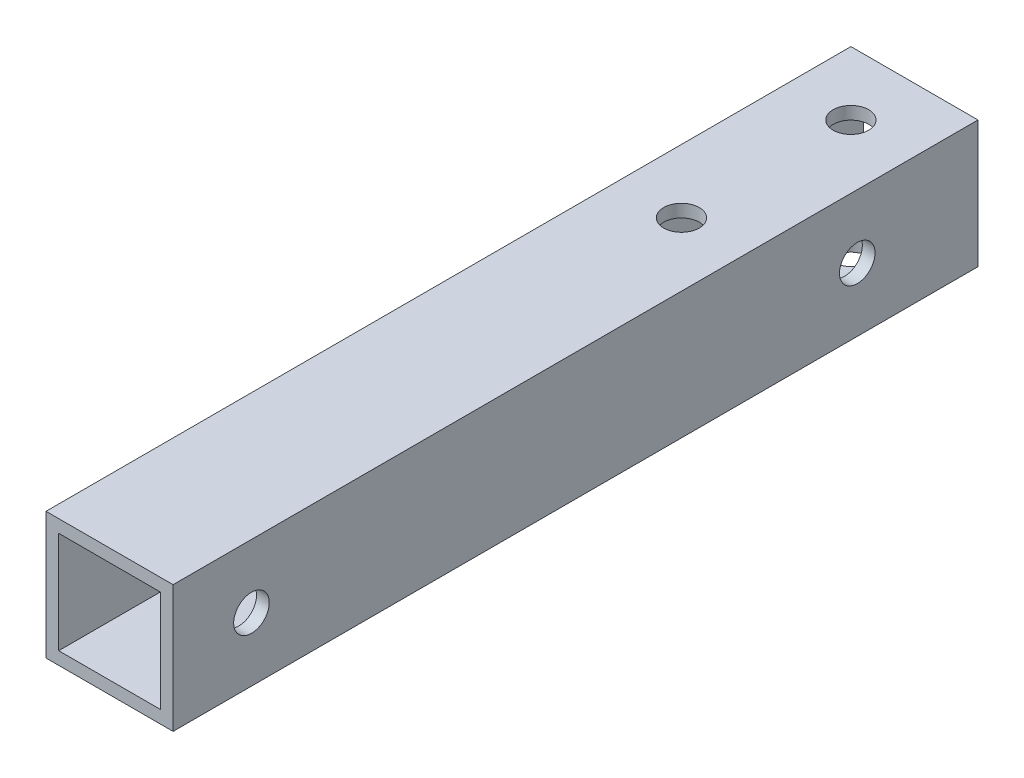
ISO-10303-21;
HEADER;
FILE_DESCRIPTION(('STEP AP214'),'2;1');
FILE_NAME('part.step','',(''),(''),'','','');
FILE_SCHEMA(('AUTOMOTIVE_DESIGN { 1 0 10303 214 1 1 1 1 }'));
ENDSEC;
DATA;
#1=APPLICATION_CONTEXT('core data for automotive mechanical design processes');
#2=APPLICATION_PROTOCOL_DEFINITION('international standard','automotive_design',2000,#1);
#3=PRODUCT_CONTEXT('',#1,'mechanical');
#4=PRODUCT('Part','Part','',(#3));
#5=PRODUCT_RELATED_PRODUCT_CATEGORY('part','',(#4));
#6=PRODUCT_DEFINITION_FORMATION('','',#4);
#7=PRODUCT_DEFINITION_CONTEXT('part definition',#1,'design');
#8=PRODUCT_DEFINITION('design','',#6,#7);
#9=PRODUCT_DEFINITION_SHAPE('','',#8);
#10=(LENGTH_UNIT() NAMED_UNIT(*) SI_UNIT(.MILLI.,.METRE.));
#11=(NAMED_UNIT(*) PLANE_ANGLE_UNIT() SI_UNIT($,.RADIAN.));
#12=(NAMED_UNIT(*) SI_UNIT($,.STERADIAN.) SOLID_ANGLE_UNIT());
#13=UNCERTAINTY_MEASURE_WITH_UNIT(LENGTH_MEASURE(1.E-05),#10,'distance_accuracy_value','');
#14=(GEOMETRIC_REPRESENTATION_CONTEXT(3) GLOBAL_UNCERTAINTY_ASSIGNED_CONTEXT((#13)) GLOBAL_UNIT_ASSIGNED_CONTEXT((#10,
#11,#12)) REPRESENTATION_CONTEXT('',''));
#15=CARTESIAN_POINT('',(0.,0.,0.));
#16=DIRECTION('',(0.,0.,1.));
#17=DIRECTION('',(1.,0.,0.));
#18=AXIS2_PLACEMENT_3D('',#15,#16,#17);
#19=CARTESIAN_POINT('',(0.,0.,95.));
#20=DIRECTION('',(0.,0.,1.));
#21=DIRECTION('',(1.,0.,0.));
#22=AXIS2_PLACEMENT_3D('',#19,#20,#21);
#23=PLANE('',#22);
#24=DIRECTION('',(0.,1.,0.));
#25=VECTOR('',#24,1.);
#26=CARTESIAN_POINT('',(7.5,7.5,95.));
#27=LINE('',#26,#25);
#28=CARTESIAN_POINT('',(7.5,-7.5,95.));
#29=VERTEX_POINT('',#28);
#30=CARTESIAN_POINT('',(7.5,7.5,95.));
#31=VERTEX_POINT('',#30);
#32=EDGE_CURVE('E164',#29,#31,#27,.T.);
#33=ORIENTED_EDGE('',*,*,#32,.T.);
#34=DIRECTION('',(-1.,0.,0.));
#35=VECTOR('',#34,1.);
#36=CARTESIAN_POINT('',(-7.5,7.5,95.));
#37=LINE('',#36,#35);
#38=CARTESIAN_POINT('',(-7.5,7.5,95.));
#39=VERTEX_POINT('',#38);
#40=EDGE_CURVE('E167',#31,#39,#37,.T.);
#41=ORIENTED_EDGE('',*,*,#40,.T.);
#42=DIRECTION('',(0.,-1.,0.));
#43=VECTOR('',#42,1.);
#44=CARTESIAN_POINT('',(-7.5,7.5,95.));
#45=LINE('',#44,#43);
#46=CARTESIAN_POINT('',(-7.5,-7.5,95.));
#47=VERTEX_POINT('',#46);
#48=EDGE_CURVE('E170',#39,#47,#45,.T.);
#49=ORIENTED_EDGE('',*,*,#48,.T.);
#50=DIRECTION('',(1.,0.,0.));
#51=VECTOR('',#50,1.);
#52=CARTESIAN_POINT('',(-7.5,-7.5,95.));
#53=LINE('',#52,#51);
#54=EDGE_CURVE('E172',#47,#29,#53,.T.);
#55=ORIENTED_EDGE('',*,*,#54,.T.);
#56=EDGE_LOOP('',(#33,#41,#49,#55));
#57=FACE_BOUND('',#56,.T.);
#58=DIRECTION('',(-1.,0.,0.));
#59=VECTOR('',#58,1.);
#60=CARTESIAN_POINT('',(-7.5,6.,95.));
#61=LINE('',#60,#59);
#62=CARTESIAN_POINT('',(6.,6.,95.));
#63=VERTEX_POINT('',#62);
#64=CARTESIAN_POINT('',(-6.,6.,95.));
#65=VERTEX_POINT('',#64);
#66=EDGE_CURVE('E134',#63,#65,#61,.T.);
#67=ORIENTED_EDGE('',*,*,#66,.F.);
#68=DIRECTION('',(0.,1.,0.));
#69=VECTOR('',#68,1.);
#70=CARTESIAN_POINT('',(6.,7.5,95.));
#71=LINE('',#70,#69);
#72=CARTESIAN_POINT('',(6.,-6.,95.));
#73=VERTEX_POINT('',#72);
#74=EDGE_CURVE('E126',#73,#63,#71,.T.);
#75=ORIENTED_EDGE('',*,*,#74,.F.);
#76=DIRECTION('',(1.,0.,0.));
#77=VECTOR('',#76,1.);
#78=CARTESIAN_POINT('',(-7.5,-6.,95.));
#79=LINE('',#78,#77);
#80=CARTESIAN_POINT('',(-6.,-6.,95.));
#81=VERTEX_POINT('',#80);
#82=EDGE_CURVE('E148',#81,#73,#79,.T.);
#83=ORIENTED_EDGE('',*,*,#82,.F.);
#84=DIRECTION('',(0.,-1.,0.));
#85=VECTOR('',#84,1.);
#86=CARTESIAN_POINT('',(-6.,7.5,95.));
#87=LINE('',#86,#85);
#88=EDGE_CURVE('E146',#65,#81,#87,.T.);
#89=ORIENTED_EDGE('',*,*,#88,.F.);
#90=EDGE_LOOP('',(#67,#75,#83,#89));
#91=FACE_BOUND('',#90,.T.);
#92=ADVANCED_FACE('F59',(#57,#91),#23,.T.);
#93=CARTESIAN_POINT('',(0.,0.,0.));
#94=DIRECTION('',(0.,0.,1.));
#95=DIRECTION('',(1.,0.,0.));
#96=AXIS2_PLACEMENT_3D('',#93,#94,#95);
#97=PLANE('',#96);
#98=DIRECTION('',(0.,1.,0.));
#99=VECTOR('',#98,1.);
#100=CARTESIAN_POINT('',(7.5,7.5,0.));
#101=LINE('',#100,#99);
#102=CARTESIAN_POINT('',(7.5,-7.5,0.));
#103=VERTEX_POINT('',#102);
#104=CARTESIAN_POINT('',(7.5,7.5,0.));
#105=VERTEX_POINT('',#104);
#106=EDGE_CURVE('E142',#103,#105,#101,.T.);
#107=ORIENTED_EDGE('',*,*,#106,.F.);
#108=DIRECTION('',(1.,0.,0.));
#109=VECTOR('',#108,1.);
#110=CARTESIAN_POINT('',(-7.5,-7.5,0.));
#111=LINE('',#110,#109);
#112=CARTESIAN_POINT('',(-7.5,-7.5,0.));
#113=VERTEX_POINT('',#112);
#114=EDGE_CURVE('E168',#113,#103,#111,.T.);
#115=ORIENTED_EDGE('',*,*,#114,.F.);
#116=DIRECTION('',(0.,-1.,0.));
#117=VECTOR('',#116,1.);
#118=CARTESIAN_POINT('',(-7.5,7.5,0.));
#119=LINE('',#118,#117);
#120=CARTESIAN_POINT('',(-7.5,7.5,0.));
#121=VERTEX_POINT('',#120);
#122=EDGE_CURVE('E179',#121,#113,#119,.T.);
#123=ORIENTED_EDGE('',*,*,#122,.F.);
#124=DIRECTION('',(-1.,0.,0.));
#125=VECTOR('',#124,1.);
#126=CARTESIAN_POINT('',(-7.5,7.5,0.));
#127=LINE('',#126,#125);
#128=EDGE_CURVE('E177',#105,#121,#127,.T.);
#129=ORIENTED_EDGE('',*,*,#128,.F.);
#130=EDGE_LOOP('',(#107,#115,#123,#129));
#131=FACE_BOUND('',#130,.T.);
#132=DIRECTION('',(0.,1.,0.));
#133=VECTOR('',#132,1.);
#134=CARTESIAN_POINT('',(6.,7.5,0.));
#135=LINE('',#134,#133);
#136=CARTESIAN_POINT('',(6.,-6.,0.));
#137=VERTEX_POINT('',#136);
#138=CARTESIAN_POINT('',(6.,6.,0.));
#139=VERTEX_POINT('',#138);
#140=EDGE_CURVE('E84',#137,#139,#135,.T.);
#141=ORIENTED_EDGE('',*,*,#140,.T.);
#142=DIRECTION('',(-1.,0.,0.));
#143=VECTOR('',#142,1.);
#144=CARTESIAN_POINT('',(-7.5,6.,0.));
#145=LINE('',#144,#143);
#146=CARTESIAN_POINT('',(-6.,6.,0.));
#147=VERTEX_POINT('',#146);
#148=EDGE_CURVE('E141',#139,#147,#145,.T.);
#149=ORIENTED_EDGE('',*,*,#148,.T.);
#150=DIRECTION('',(0.,-1.,0.));
#151=VECTOR('',#150,1.);
#152=CARTESIAN_POINT('',(-6.,7.5,0.));
#153=LINE('',#152,#151);
#154=CARTESIAN_POINT('',(-6.,-6.,0.));
#155=VERTEX_POINT('',#154);
#156=EDGE_CURVE('E156',#147,#155,#153,.T.);
#157=ORIENTED_EDGE('',*,*,#156,.T.);
#158=DIRECTION('',(1.,0.,0.));
#159=VECTOR('',#158,1.);
#160=CARTESIAN_POINT('',(-7.5,-6.,0.));
#161=LINE('',#160,#159);
#162=EDGE_CURVE('E135',#155,#137,#161,.T.);
#163=ORIENTED_EDGE('',*,*,#162,.T.);
#164=EDGE_LOOP('',(#141,#149,#157,#163));
#165=FACE_BOUND('',#164,.T.);
#166=ADVANCED_FACE('F256',(#131,#165),#97,.F.);
#167=CARTESIAN_POINT('',(7.5,7.5,95.));
#168=DIRECTION('',(-1.,0.,0.));
#169=DIRECTION('',(0.,-1.,0.));
#170=AXIS2_PLACEMENT_3D('',#167,#168,#169);
#171=PLANE('',#170);
#172=CARTESIAN_POINT('',(7.5,0.,14.25));
#173=DIRECTION('',(1.,0.,0.));
#174=DIRECTION('',(0.,1.,0.));
#175=AXIS2_PLACEMENT_3D('',#172,#173,#174);
#176=CIRCLE('',#175,2.1);
#177=CARTESIAN_POINT('',(7.5,2.10000000000001,14.25));
#178=VERTEX_POINT('',#177);
#179=EDGE_CURVE('E224',#178,#178,#176,.T.);
#180=ORIENTED_EDGE('',*,*,#179,.F.);
#181=EDGE_LOOP('',(#180));
#182=FACE_BOUND('',#181,.T.);
#183=CARTESIAN_POINT('',(7.5,0.,85.75));
#184=DIRECTION('',(1.,0.,0.));
#185=DIRECTION('',(0.,1.,0.));
#186=AXIS2_PLACEMENT_3D('',#183,#184,#185);
#187=CIRCLE('',#186,2.1);
#188=CARTESIAN_POINT('',(7.5,2.10000000000001,85.75));
#189=VERTEX_POINT('',#188);
#190=EDGE_CURVE('E221',#189,#189,#187,.T.);
#191=ORIENTED_EDGE('',*,*,#190,.F.);
#192=EDGE_LOOP('',(#191));
#193=FACE_BOUND('',#192,.T.);
#194=ORIENTED_EDGE('',*,*,#106,.T.);
#195=DIRECTION('',(0.,0.,-1.));
#196=VECTOR('',#195,1.);
#197=CARTESIAN_POINT('',(7.5,7.5,95.));
#198=LINE('',#197,#196);
#199=EDGE_CURVE('E12',#31,#105,#198,.T.);
#200=ORIENTED_EDGE('',*,*,#199,.F.);
#201=ORIENTED_EDGE('',*,*,#32,.F.);
#202=DIRECTION('',(0.,0.,-1.));
#203=VECTOR('',#202,1.);
#204=CARTESIAN_POINT('',(7.5,-7.5,95.));
#205=LINE('',#204,#203);
#206=EDGE_CURVE('E174',#29,#103,#205,.T.);
#207=ORIENTED_EDGE('',*,*,#206,.T.);
#208=EDGE_LOOP('',(#194,#200,#201,#207));
#209=FACE_BOUND('',#208,.T.);
#210=ADVANCED_FACE('F61',(#182,#193,#209),#171,.F.);
#211=CARTESIAN_POINT('',(-7.5,7.5,95.));
#212=DIRECTION('',(0.,-1.,0.));
#213=DIRECTION('',(0.,0.,-1.));
#214=AXIS2_PLACEMENT_3D('',#211,#212,#213);
#215=PLANE('',#214);
#216=CARTESIAN_POINT('',(0.,7.5,27.5));
#217=DIRECTION('',(0.,1.,0.));
#218=DIRECTION('',(0.,0.,1.));
#219=AXIS2_PLACEMENT_3D('',#216,#217,#218);
#220=CIRCLE('',#219,2.1);
#221=CARTESIAN_POINT('',(0.,7.5,29.6));
#222=VERTEX_POINT('',#221);
#223=EDGE_CURVE('E205',#222,#222,#220,.T.);
#224=ORIENTED_EDGE('',*,*,#223,.F.);
#225=EDGE_LOOP('',(#224));
#226=FACE_BOUND('',#225,.T.);
#227=CARTESIAN_POINT('',(0.,7.5,7.5));
#228=DIRECTION('',(0.,1.,0.));
#229=DIRECTION('',(0.,0.,1.));
#230=AXIS2_PLACEMENT_3D('',#227,#228,#229);
#231=CIRCLE('',#230,2.1);
#232=CARTESIAN_POINT('',(0.,7.5,9.6));
#233=VERTEX_POINT('',#232);
#234=EDGE_CURVE('E215',#233,#233,#231,.T.);
#235=ORIENTED_EDGE('',*,*,#234,.F.);
#236=EDGE_LOOP('',(#235));
#237=FACE_BOUND('',#236,.T.);
#238=ORIENTED_EDGE('',*,*,#128,.T.);
#239=DIRECTION('',(0.,0.,-1.));
#240=VECTOR('',#239,1.);
#241=CARTESIAN_POINT('',(-7.5,7.5,95.));
#242=LINE('',#241,#240);
#243=EDGE_CURVE('E68',#39,#121,#242,.T.);
#244=ORIENTED_EDGE('',*,*,#243,.F.);
#245=ORIENTED_EDGE('',*,*,#40,.F.);
#246=ORIENTED_EDGE('',*,*,#199,.T.);
#247=EDGE_LOOP('',(#238,#244,#245,#246));
#248=FACE_BOUND('',#247,.T.);
#249=ADVANCED_FACE('F255',(#226,#237,#248),#215,.F.);
#250=CARTESIAN_POINT('',(-7.5,7.5,95.));
#251=DIRECTION('',(1.,0.,0.));
#252=DIRECTION('',(0.,1.,0.));
#253=AXIS2_PLACEMENT_3D('',#250,#251,#252);
#254=PLANE('',#253);
#255=CARTESIAN_POINT('',(-7.5,0.,14.25));
#256=DIRECTION('',(1.,0.,0.));
#257=DIRECTION('',(0.,1.,0.));
#258=AXIS2_PLACEMENT_3D('',#255,#256,#257);
#259=CIRCLE('',#258,2.1);
#260=CARTESIAN_POINT('',(-7.5,2.1,14.25));
#261=VERTEX_POINT('',#260);
#262=EDGE_CURVE('E193',#261,#261,#259,.T.);
#263=ORIENTED_EDGE('',*,*,#262,.T.);
#264=EDGE_LOOP('',(#263));
#265=FACE_BOUND('',#264,.T.);
#266=CARTESIAN_POINT('',(-7.5,0.,85.75));
#267=DIRECTION('',(1.,0.,0.));
#268=DIRECTION('',(0.,1.,0.));
#269=AXIS2_PLACEMENT_3D('',#266,#267,#268);
#270=CIRCLE('',#269,2.1);
#271=CARTESIAN_POINT('',(-7.5,2.1,85.75));
#272=VERTEX_POINT('',#271);
#273=EDGE_CURVE('E227',#272,#272,#270,.T.);
#274=ORIENTED_EDGE('',*,*,#273,.T.);
#275=EDGE_LOOP('',(#274));
#276=FACE_BOUND('',#275,.T.);
#277=ORIENTED_EDGE('',*,*,#122,.T.);
#278=DIRECTION('',(0.,0.,-1.));
#279=VECTOR('',#278,1.);
#280=CARTESIAN_POINT('',(-7.5,-7.5,95.));
#281=LINE('',#280,#279);
#282=EDGE_CURVE('E184',#47,#113,#281,.T.);
#283=ORIENTED_EDGE('',*,*,#282,.F.);
#284=ORIENTED_EDGE('',*,*,#48,.F.);
#285=ORIENTED_EDGE('',*,*,#243,.T.);
#286=EDGE_LOOP('',(#277,#283,#284,#285));
#287=FACE_BOUND('',#286,.T.);
#288=ADVANCED_FACE('F274',(#265,#276,#287),#254,.F.);
#289=CARTESIAN_POINT('',(-7.5,-7.5,95.));
#290=DIRECTION('',(0.,1.,0.));
#291=DIRECTION('',(0.,0.,1.));
#292=AXIS2_PLACEMENT_3D('',#289,#290,#291);
#293=PLANE('',#292);
#294=CARTESIAN_POINT('',(0.,-7.5,27.5));
#295=DIRECTION('',(0.,1.,0.));
#296=DIRECTION('',(0.,0.,1.));
#297=AXIS2_PLACEMENT_3D('',#294,#295,#296);
#298=CIRCLE('',#297,2.1);
#299=CARTESIAN_POINT('',(0.,-7.5,29.6));
#300=VERTEX_POINT('',#299);
#301=EDGE_CURVE('E199',#300,#300,#298,.T.);
#302=ORIENTED_EDGE('',*,*,#301,.T.);
#303=EDGE_LOOP('',(#302));
#304=FACE_BOUND('',#303,.T.);
#305=CARTESIAN_POINT('',(0.,-7.5,7.5));
#306=DIRECTION('',(0.,1.,0.));
#307=DIRECTION('',(0.,0.,1.));
#308=AXIS2_PLACEMENT_3D('',#305,#306,#307);
#309=CIRCLE('',#308,2.1);
#310=CARTESIAN_POINT('',(0.,-7.5,9.6));
#311=VERTEX_POINT('',#310);
#312=EDGE_CURVE('E210',#311,#311,#309,.T.);
#313=ORIENTED_EDGE('',*,*,#312,.T.);
#314=EDGE_LOOP('',(#313));
#315=FACE_BOUND('',#314,.T.);
#316=ORIENTED_EDGE('',*,*,#114,.T.);
#317=ORIENTED_EDGE('',*,*,#206,.F.);
#318=ORIENTED_EDGE('',*,*,#54,.F.);
#319=ORIENTED_EDGE('',*,*,#282,.T.);
#320=EDGE_LOOP('',(#316,#317,#318,#319));
#321=FACE_BOUND('',#320,.T.);
#322=ADVANCED_FACE('F241',(#304,#315,#321),#293,.F.);
#323=CARTESIAN_POINT('',(6.,7.5,95.));
#324=DIRECTION('',(-1.,0.,0.));
#325=DIRECTION('',(0.,-1.,0.));
#326=AXIS2_PLACEMENT_3D('',#323,#324,#325);
#327=PLANE('',#326);
#328=CARTESIAN_POINT('',(6.,0.,14.25));
#329=DIRECTION('',(-1.,0.,0.));
#330=DIRECTION('',(0.,-1.,0.));
#331=AXIS2_PLACEMENT_3D('',#328,#329,#330);
#332=CIRCLE('',#331,2.1);
#333=CARTESIAN_POINT('',(6.,2.10000000000001,14.25));
#334=VERTEX_POINT('',#333);
#335=EDGE_CURVE('E154',#334,#334,#332,.T.);
#336=ORIENTED_EDGE('',*,*,#335,.F.);
#337=EDGE_LOOP('',(#336));
#338=FACE_BOUND('',#337,.T.);
#339=CARTESIAN_POINT('',(6.,0.,85.75));
#340=DIRECTION('',(-1.,0.,0.));
#341=DIRECTION('',(0.,-1.,0.));
#342=AXIS2_PLACEMENT_3D('',#339,#340,#341);
#343=CIRCLE('',#342,2.1);
#344=CARTESIAN_POINT('',(6.,2.10000000000001,85.75));
#345=VERTEX_POINT('',#344);
#346=EDGE_CURVE('E192',#345,#345,#343,.T.);
#347=ORIENTED_EDGE('',*,*,#346,.F.);
#348=EDGE_LOOP('',(#347));
#349=FACE_BOUND('',#348,.T.);
#350=ORIENTED_EDGE('',*,*,#140,.F.);
#351=DIRECTION('',(0.,0.,-1.));
#352=VECTOR('',#351,1.);
#353=CARTESIAN_POINT('',(6.,-6.,95.));
#354=LINE('',#353,#352);
#355=EDGE_CURVE('E130',#73,#137,#354,.T.);
#356=ORIENTED_EDGE('',*,*,#355,.F.);
#357=ORIENTED_EDGE('',*,*,#74,.T.);
#358=DIRECTION('',(0.,0.,-1.));
#359=VECTOR('',#358,1.);
#360=CARTESIAN_POINT('',(6.,6.,95.));
#361=LINE('',#360,#359);
#362=EDGE_CURVE('E129',#63,#139,#361,.T.);
#363=ORIENTED_EDGE('',*,*,#362,.T.);
#364=EDGE_LOOP('',(#350,#356,#357,#363));
#365=FACE_BOUND('',#364,.T.);
#366=ADVANCED_FACE('F128',(#338,#349,#365),#327,.T.);
#367=CARTESIAN_POINT('',(-7.5,6.,95.));
#368=DIRECTION('',(0.,-1.,0.));
#369=DIRECTION('',(0.,0.,-1.));
#370=AXIS2_PLACEMENT_3D('',#367,#368,#369);
#371=PLANE('',#370);
#372=CARTESIAN_POINT('',(0.,6.,27.5));
#373=DIRECTION('',(0.,-1.,0.));
#374=DIRECTION('',(0.,0.,-1.));
#375=AXIS2_PLACEMENT_3D('',#372,#373,#374);
#376=CIRCLE('',#375,2.1);
#377=CARTESIAN_POINT('',(0.,6.,25.4));
#378=VERTEX_POINT('',#377);
#379=EDGE_CURVE('E218',#378,#378,#376,.T.);
#380=ORIENTED_EDGE('',*,*,#379,.F.);
#381=EDGE_LOOP('',(#380));
#382=FACE_BOUND('',#381,.T.);
#383=CARTESIAN_POINT('',(0.,6.,7.5));
#384=DIRECTION('',(0.,-1.,0.));
#385=DIRECTION('',(0.,0.,-1.));
#386=AXIS2_PLACEMENT_3D('',#383,#384,#385);
#387=CIRCLE('',#386,2.1);
#388=CARTESIAN_POINT('',(0.,6.,5.4));
#389=VERTEX_POINT('',#388);
#390=EDGE_CURVE('E198',#389,#389,#387,.T.);
#391=ORIENTED_EDGE('',*,*,#390,.F.);
#392=EDGE_LOOP('',(#391));
#393=FACE_BOUND('',#392,.T.);
#394=ORIENTED_EDGE('',*,*,#148,.F.);
#395=ORIENTED_EDGE('',*,*,#362,.F.);
#396=ORIENTED_EDGE('',*,*,#66,.T.);
#397=DIRECTION('',(0.,0.,-1.));
#398=VECTOR('',#397,1.);
#399=CARTESIAN_POINT('',(-6.,6.,95.));
#400=LINE('',#399,#398);
#401=EDGE_CURVE('E143',#65,#147,#400,.T.);
#402=ORIENTED_EDGE('',*,*,#401,.T.);
#403=EDGE_LOOP('',(#394,#395,#396,#402));
#404=FACE_BOUND('',#403,.T.);
#405=ADVANCED_FACE('F138',(#382,#393,#404),#371,.T.);
#406=CARTESIAN_POINT('',(-6.,7.5,95.));
#407=DIRECTION('',(1.,0.,0.));
#408=DIRECTION('',(0.,1.,0.));
#409=AXIS2_PLACEMENT_3D('',#406,#407,#408);
#410=PLANE('',#409);
#411=CARTESIAN_POINT('',(-6.,0.,14.25));
#412=DIRECTION('',(1.,0.,0.));
#413=DIRECTION('',(0.,1.,0.));
#414=AXIS2_PLACEMENT_3D('',#411,#412,#413);
#415=CIRCLE('',#414,2.1);
#416=CARTESIAN_POINT('',(-6.,2.1,14.25));
#417=VERTEX_POINT('',#416);
#418=EDGE_CURVE('E194',#417,#417,#415,.T.);
#419=ORIENTED_EDGE('',*,*,#418,.F.);
#420=EDGE_LOOP('',(#419));
#421=FACE_BOUND('',#420,.T.);
#422=CARTESIAN_POINT('',(-6.,0.,85.75));
#423=DIRECTION('',(1.,0.,0.));
#424=DIRECTION('',(0.,1.,0.));
#425=AXIS2_PLACEMENT_3D('',#422,#423,#424);
#426=CIRCLE('',#425,2.1);
#427=CARTESIAN_POINT('',(-6.,2.1,85.75));
#428=VERTEX_POINT('',#427);
#429=EDGE_CURVE('E189',#428,#428,#426,.T.);
#430=ORIENTED_EDGE('',*,*,#429,.F.);
#431=EDGE_LOOP('',(#430));
#432=FACE_BOUND('',#431,.T.);
#433=ORIENTED_EDGE('',*,*,#156,.F.);
#434=ORIENTED_EDGE('',*,*,#401,.F.);
#435=ORIENTED_EDGE('',*,*,#88,.T.);
#436=DIRECTION('',(0.,0.,-1.));
#437=VECTOR('',#436,1.);
#438=CARTESIAN_POINT('',(-6.,-6.,95.));
#439=LINE('',#438,#437);
#440=EDGE_CURVE('E76',#81,#155,#439,.T.);
#441=ORIENTED_EDGE('',*,*,#440,.T.);
#442=EDGE_LOOP('',(#433,#434,#435,#441));
#443=FACE_BOUND('',#442,.T.);
#444=ADVANCED_FACE('F294',(#421,#432,#443),#410,.T.);
#445=CARTESIAN_POINT('',(-7.5,-6.,95.));
#446=DIRECTION('',(0.,1.,0.));
#447=DIRECTION('',(0.,0.,1.));
#448=AXIS2_PLACEMENT_3D('',#445,#446,#447);
#449=PLANE('',#448);
#450=CARTESIAN_POINT('',(0.,-6.,27.5));
#451=DIRECTION('',(0.,1.,0.));
#452=DIRECTION('',(0.,0.,1.));
#453=AXIS2_PLACEMENT_3D('',#450,#451,#452);
#454=CIRCLE('',#453,2.1);
#455=CARTESIAN_POINT('',(0.,-6.,29.6));
#456=VERTEX_POINT('',#455);
#457=EDGE_CURVE('E63',#456,#456,#454,.T.);
#458=ORIENTED_EDGE('',*,*,#457,.F.);
#459=EDGE_LOOP('',(#458));
#460=FACE_BOUND('',#459,.T.);
#461=CARTESIAN_POINT('',(0.,-6.,7.5));
#462=DIRECTION('',(0.,1.,0.));
#463=DIRECTION('',(0.,0.,1.));
#464=AXIS2_PLACEMENT_3D('',#461,#462,#463);
#465=CIRCLE('',#464,2.1);
#466=CARTESIAN_POINT('',(0.,-6.,9.6));
#467=VERTEX_POINT('',#466);
#468=EDGE_CURVE('E196',#467,#467,#465,.T.);
#469=ORIENTED_EDGE('',*,*,#468,.F.);
#470=EDGE_LOOP('',(#469));
#471=FACE_BOUND('',#470,.T.);
#472=ORIENTED_EDGE('',*,*,#162,.F.);
#473=ORIENTED_EDGE('',*,*,#440,.F.);
#474=ORIENTED_EDGE('',*,*,#82,.T.);
#475=ORIENTED_EDGE('',*,*,#355,.T.);
#476=EDGE_LOOP('',(#472,#473,#474,#475));
#477=FACE_BOUND('',#476,.T.);
#478=ADVANCED_FACE('F298',(#460,#471,#477),#449,.T.);
#479=CARTESIAN_POINT('',(-7.5,0.,85.75));
#480=DIRECTION('',(1.,0.,0.));
#481=DIRECTION('',(0.,1.,0.));
#482=AXIS2_PLACEMENT_3D('',#479,#480,#481);
#483=CYLINDRICAL_SURFACE('',#482,2.1);
#484=CARTESIAN_POINT('',(-6.,2.1,85.75));
#485=CARTESIAN_POINT('',(-6.015625,2.1,85.75));
#486=CARTESIAN_POINT('',(-6.03125,2.1,85.75));
#487=CARTESIAN_POINT('',(-6.0625,2.1,85.75));
#488=CARTESIAN_POINT('',(-6.078125,2.1,85.75));
#489=CARTESIAN_POINT('',(-6.109375,2.1,85.75));
#490=CARTESIAN_POINT('',(-6.125,2.1,85.75));
#491=CARTESIAN_POINT('',(-6.15625,2.1,85.75));
#492=CARTESIAN_POINT('',(-6.171875,2.1,85.75));
#493=CARTESIAN_POINT('',(-6.203125,2.1,85.75));
#494=CARTESIAN_POINT('',(-6.21875,2.1,85.75));
#495=CARTESIAN_POINT('',(-6.25,2.1,85.75));
#496=CARTESIAN_POINT('',(-6.265625,2.1,85.75));
#497=CARTESIAN_POINT('',(-6.296875,2.1,85.75));
#498=CARTESIAN_POINT('',(-6.3125,2.1,85.75));
#499=CARTESIAN_POINT('',(-6.34375,2.1,85.75));
#500=CARTESIAN_POINT('',(-6.359375,2.1,85.75));
#501=CARTESIAN_POINT('',(-6.390625,2.1,85.75));
#502=CARTESIAN_POINT('',(-6.40625,2.1,85.75));
#503=CARTESIAN_POINT('',(-6.4375,2.1,85.75));
#504=CARTESIAN_POINT('',(-6.453125,2.1,85.75));
#505=CARTESIAN_POINT('',(-6.484375,2.1,85.75));
#506=CARTESIAN_POINT('',(-6.5,2.1,85.75));
#507=CARTESIAN_POINT('',(-6.53125,2.1,85.75));
#508=CARTESIAN_POINT('',(-6.546875,2.1,85.75));
#509=CARTESIAN_POINT('',(-6.578125,2.1,85.75));
#510=CARTESIAN_POINT('',(-6.59375,2.1,85.75));
#511=CARTESIAN_POINT('',(-6.625,2.1,85.75));
#512=CARTESIAN_POINT('',(-6.640625,2.1,85.75));
#513=CARTESIAN_POINT('',(-6.671875,2.1,85.75));
#514=CARTESIAN_POINT('',(-6.6875,2.1,85.75));
#515=CARTESIAN_POINT('',(-6.71875,2.1,85.75));
#516=CARTESIAN_POINT('',(-6.734375,2.1,85.75));
#517=CARTESIAN_POINT('',(-6.765625,2.1,85.75));
#518=CARTESIAN_POINT('',(-6.78125,2.1,85.75));
#519=CARTESIAN_POINT('',(-6.8125,2.1,85.75));
#520=CARTESIAN_POINT('',(-6.828125,2.1,85.75));
#521=CARTESIAN_POINT('',(-6.859375,2.1,85.75));
#522=CARTESIAN_POINT('',(-6.875,2.1,85.75));
#523=CARTESIAN_POINT('',(-6.90625,2.1,85.75));
#524=CARTESIAN_POINT('',(-6.921875,2.1,85.75));
#525=CARTESIAN_POINT('',(-6.953125,2.1,85.75));
#526=CARTESIAN_POINT('',(-6.96875,2.1,85.75));
#527=CARTESIAN_POINT('',(-7.,2.1,85.75));
#528=CARTESIAN_POINT('',(-7.015625,2.1,85.75));
#529=CARTESIAN_POINT('',(-7.046875,2.1,85.75));
#530=CARTESIAN_POINT('',(-7.0625,2.1,85.75));
#531=CARTESIAN_POINT('',(-7.09375,2.1,85.75));
#532=CARTESIAN_POINT('',(-7.109375,2.1,85.75));
#533=CARTESIAN_POINT('',(-7.140625,2.1,85.75));
#534=CARTESIAN_POINT('',(-7.15625,2.1,85.75));
#535=CARTESIAN_POINT('',(-7.1875,2.1,85.75));
#536=CARTESIAN_POINT('',(-7.203125,2.1,85.75));
#537=CARTESIAN_POINT('',(-7.234375,2.1,85.75));
#538=CARTESIAN_POINT('',(-7.25,2.1,85.75));
#539=CARTESIAN_POINT('',(-7.28125,2.1,85.75));
#540=CARTESIAN_POINT('',(-7.296875,2.1,85.75));
#541=CARTESIAN_POINT('',(-7.328125,2.1,85.75));
#542=CARTESIAN_POINT('',(-7.34375,2.1,85.75));
#543=CARTESIAN_POINT('',(-7.375,2.1,85.75));
#544=CARTESIAN_POINT('',(-7.390625,2.1,85.75));
#545=CARTESIAN_POINT('',(-7.421875,2.1,85.75));
#546=CARTESIAN_POINT('',(-7.4375,2.1,85.75));
#547=CARTESIAN_POINT('',(-7.46875,2.1,85.75));
#548=CARTESIAN_POINT('',(-7.484375,2.1,85.75));
#549=CARTESIAN_POINT('',(-7.5,2.1,85.75));
#550=B_SPLINE_CURVE_WITH_KNOTS('',3,(#484,#485,#486,#487,#488,#489,#490,#491,#492,#493,#494,
#495,#496,#497,#498,#499,#500,#501,#502,#503,#504,#505,#506,#507,#508,#509,#510,#511,#512,#513,
#514,#515,#516,#517,#518,#519,#520,#521,#522,#523,#524,#525,#526,#527,#528,#529,#530,#531,#532,
#533,#534,#535,#536,#537,#538,#539,#540,#541,#542,#543,#544,#545,#546,#547,#548,#549),
.UNSPECIFIED.,.F.,.F.,(4,2,2,2,2,2,2,2,2,2,2,2,2,2,2,2,2,2,2,2,2,2,2,2,2,2,2,2,2,2,2,2,4),(0.,
0.046875,0.0937500000000001,0.140625,0.1875,0.234375,0.28125,0.328125,0.375,0.421875,0.46875,
0.515625000000001,0.5625,0.609375000000001,0.656250000000001,0.703125000000001,
0.750000000000002,0.796875000000002,0.843750000000002,0.890625000000002,0.937500000000002,
0.984375000000002,1.03125,1.078125,1.125,1.171875,1.21875,1.265625,1.3125,1.359375,1.40625,
1.453125,1.5),.UNSPECIFIED.);
#551=EDGE_CURVE('BSEAM250',#428,#272,#550,.T.);
#552=ORIENTED_EDGE('',*,*,#429,.T.);
#553=ORIENTED_EDGE('',*,*,#273,.F.);
#554=ORIENTED_EDGE('',*,*,#551,.T.);
#555=ORIENTED_EDGE('',*,*,#551,.F.);
#556=EDGE_LOOP('',(#552,#554,#553,#555));
#557=FACE_BOUND('',#556,.T.);
#558=ADVANCED_FACE('F250',(#557),#483,.F.);
#559=CARTESIAN_POINT('',(-7.5,0.,14.25));
#560=DIRECTION('',(1.,0.,0.));
#561=DIRECTION('',(0.,1.,0.));
#562=AXIS2_PLACEMENT_3D('',#559,#560,#561);
#563=CYLINDRICAL_SURFACE('',#562,2.1);
#564=CARTESIAN_POINT('',(-6.,2.1,14.25));
#565=CARTESIAN_POINT('',(-6.015625,2.1,14.25));
#566=CARTESIAN_POINT('',(-6.03125,2.1,14.25));
#567=CARTESIAN_POINT('',(-6.0625,2.1,14.25));
#568=CARTESIAN_POINT('',(-6.078125,2.1,14.25));
#569=CARTESIAN_POINT('',(-6.109375,2.1,14.25));
#570=CARTESIAN_POINT('',(-6.125,2.1,14.25));
#571=CARTESIAN_POINT('',(-6.15625,2.1,14.25));
#572=CARTESIAN_POINT('',(-6.171875,2.1,14.25));
#573=CARTESIAN_POINT('',(-6.203125,2.1,14.25));
#574=CARTESIAN_POINT('',(-6.21875,2.1,14.25));
#575=CARTESIAN_POINT('',(-6.25,2.1,14.25));
#576=CARTESIAN_POINT('',(-6.265625,2.1,14.25));
#577=CARTESIAN_POINT('',(-6.296875,2.1,14.25));
#578=CARTESIAN_POINT('',(-6.3125,2.1,14.25));
#579=CARTESIAN_POINT('',(-6.34375,2.1,14.25));
#580=CARTESIAN_POINT('',(-6.359375,2.1,14.25));
#581=CARTESIAN_POINT('',(-6.390625,2.1,14.25));
#582=CARTESIAN_POINT('',(-6.40625,2.1,14.25));
#583=CARTESIAN_POINT('',(-6.4375,2.1,14.25));
#584=CARTESIAN_POINT('',(-6.453125,2.1,14.25));
#585=CARTESIAN_POINT('',(-6.484375,2.1,14.25));
#586=CARTESIAN_POINT('',(-6.5,2.1,14.25));
#587=CARTESIAN_POINT('',(-6.53125,2.1,14.25));
#588=CARTESIAN_POINT('',(-6.546875,2.1,14.25));
#589=CARTESIAN_POINT('',(-6.578125,2.1,14.25));
#590=CARTESIAN_POINT('',(-6.59375,2.1,14.25));
#591=CARTESIAN_POINT('',(-6.625,2.1,14.25));
#592=CARTESIAN_POINT('',(-6.640625,2.1,14.25));
#593=CARTESIAN_POINT('',(-6.671875,2.1,14.25));
#594=CARTESIAN_POINT('',(-6.6875,2.1,14.25));
#595=CARTESIAN_POINT('',(-6.71875,2.1,14.25));
#596=CARTESIAN_POINT('',(-6.734375,2.1,14.25));
#597=CARTESIAN_POINT('',(-6.765625,2.1,14.25));
#598=CARTESIAN_POINT('',(-6.78125,2.1,14.25));
#599=CARTESIAN_POINT('',(-6.8125,2.1,14.25));
#600=CARTESIAN_POINT('',(-6.828125,2.1,14.25));
#601=CARTESIAN_POINT('',(-6.859375,2.1,14.25));
#602=CARTESIAN_POINT('',(-6.875,2.1,14.25));
#603=CARTESIAN_POINT('',(-6.90625,2.1,14.25));
#604=CARTESIAN_POINT('',(-6.921875,2.1,14.25));
#605=CARTESIAN_POINT('',(-6.953125,2.1,14.25));
#606=CARTESIAN_POINT('',(-6.96875,2.1,14.25));
#607=CARTESIAN_POINT('',(-7.,2.1,14.25));
#608=CARTESIAN_POINT('',(-7.015625,2.1,14.25));
#609=CARTESIAN_POINT('',(-7.046875,2.1,14.25));
#610=CARTESIAN_POINT('',(-7.0625,2.1,14.25));
#611=CARTESIAN_POINT('',(-7.09375,2.1,14.25));
#612=CARTESIAN_POINT('',(-7.109375,2.1,14.25));
#613=CARTESIAN_POINT('',(-7.140625,2.1,14.25));
#614=CARTESIAN_POINT('',(-7.15625,2.1,14.25));
#615=CARTESIAN_POINT('',(-7.1875,2.1,14.25));
#616=CARTESIAN_POINT('',(-7.203125,2.1,14.25));
#617=CARTESIAN_POINT('',(-7.234375,2.1,14.25));
#618=CARTESIAN_POINT('',(-7.25,2.1,14.25));
#619=CARTESIAN_POINT('',(-7.28125,2.1,14.25));
#620=CARTESIAN_POINT('',(-7.296875,2.1,14.25));
#621=CARTESIAN_POINT('',(-7.328125,2.1,14.25));
#622=CARTESIAN_POINT('',(-7.34375,2.1,14.25));
#623=CARTESIAN_POINT('',(-7.375,2.1,14.25));
#624=CARTESIAN_POINT('',(-7.390625,2.1,14.25));
#625=CARTESIAN_POINT('',(-7.421875,2.1,14.25));
#626=CARTESIAN_POINT('',(-7.4375,2.1,14.25));
#627=CARTESIAN_POINT('',(-7.46875,2.1,14.25));
#628=CARTESIAN_POINT('',(-7.484375,2.1,14.25));
#629=CARTESIAN_POINT('',(-7.5,2.1,14.25));
#630=B_SPLINE_CURVE_WITH_KNOTS('',3,(#564,#565,#566,#567,#568,#569,#570,#571,#572,#573,#574,
#575,#576,#577,#578,#579,#580,#581,#582,#583,#584,#585,#586,#587,#588,#589,#590,#591,#592,#593,
#594,#595,#596,#597,#598,#599,#600,#601,#602,#603,#604,#605,#606,#607,#608,#609,#610,#611,#612,
#613,#614,#615,#616,#617,#618,#619,#620,#621,#622,#623,#624,#625,#626,#627,#628,#629),
.UNSPECIFIED.,.F.,.F.,(4,2,2,2,2,2,2,2,2,2,2,2,2,2,2,2,2,2,2,2,2,2,2,2,2,2,2,2,2,2,2,2,4),(0.,
0.046875,0.0937500000000001,0.140625,0.1875,0.234375,0.28125,0.328125,0.375,0.421875,0.46875,
0.515625000000001,0.5625,0.609375000000001,0.656250000000001,0.703125000000001,
0.750000000000002,0.796875000000002,0.843750000000002,0.890625000000002,0.937500000000002,
0.984375000000002,1.03125,1.078125,1.125,1.171875,1.21875,1.265625,1.3125,1.359375,1.40625,
1.453125,1.5),.UNSPECIFIED.);
#631=EDGE_CURVE('BSEAM248',#417,#261,#630,.T.);
#632=ORIENTED_EDGE('',*,*,#418,.T.);
#633=ORIENTED_EDGE('',*,*,#262,.F.);
#634=ORIENTED_EDGE('',*,*,#631,.T.);
#635=ORIENTED_EDGE('',*,*,#631,.F.);
#636=EDGE_LOOP('',(#632,#634,#633,#635));
#637=FACE_BOUND('',#636,.T.);
#638=ADVANCED_FACE('F248',(#637),#563,.F.);
#639=CARTESIAN_POINT('',(6.,2.10000000000001,85.75));
#640=CARTESIAN_POINT('',(6.015625,2.10000000000001,85.75));
#641=CARTESIAN_POINT('',(6.03125,2.10000000000001,85.75));
#642=CARTESIAN_POINT('',(6.0625,2.10000000000001,85.75));
#643=CARTESIAN_POINT('',(6.078125,2.10000000000001,85.75));
#644=CARTESIAN_POINT('',(6.109375,2.10000000000001,85.75));
#645=CARTESIAN_POINT('',(6.125,2.10000000000001,85.75));
#646=CARTESIAN_POINT('',(6.15625,2.10000000000001,85.75));
#647=CARTESIAN_POINT('',(6.171875,2.10000000000001,85.75));
#648=CARTESIAN_POINT('',(6.203125,2.10000000000001,85.75));
#649=CARTESIAN_POINT('',(6.21875,2.10000000000001,85.75));
#650=CARTESIAN_POINT('',(6.25,2.10000000000001,85.75));
#651=CARTESIAN_POINT('',(6.265625,2.10000000000001,85.75));
#652=CARTESIAN_POINT('',(6.296875,2.10000000000001,85.75));
#653=CARTESIAN_POINT('',(6.3125,2.10000000000001,85.75));
#654=CARTESIAN_POINT('',(6.34375,2.10000000000001,85.75));
#655=CARTESIAN_POINT('',(6.359375,2.10000000000001,85.75));
#656=CARTESIAN_POINT('',(6.390625,2.10000000000001,85.75));
#657=CARTESIAN_POINT('',(6.40625,2.10000000000001,85.75));
#658=CARTESIAN_POINT('',(6.4375,2.10000000000001,85.75));
#659=CARTESIAN_POINT('',(6.453125,2.10000000000001,85.75));
#660=CARTESIAN_POINT('',(6.484375,2.10000000000001,85.75));
#661=CARTESIAN_POINT('',(6.5,2.10000000000001,85.75));
#662=CARTESIAN_POINT('',(6.53125,2.10000000000001,85.75));
#663=CARTESIAN_POINT('',(6.546875,2.10000000000001,85.75));
#664=CARTESIAN_POINT('',(6.578125,2.10000000000001,85.75));
#665=CARTESIAN_POINT('',(6.59375,2.10000000000001,85.75));
#666=CARTESIAN_POINT('',(6.625,2.10000000000001,85.75));
#667=CARTESIAN_POINT('',(6.640625,2.10000000000001,85.75));
#668=CARTESIAN_POINT('',(6.671875,2.10000000000001,85.75));
#669=CARTESIAN_POINT('',(6.6875,2.10000000000001,85.75));
#670=CARTESIAN_POINT('',(6.71875,2.10000000000001,85.75));
#671=CARTESIAN_POINT('',(6.734375,2.10000000000001,85.75));
#672=CARTESIAN_POINT('',(6.765625,2.10000000000001,85.75));
#673=CARTESIAN_POINT('',(6.78125,2.10000000000001,85.75));
#674=CARTESIAN_POINT('',(6.8125,2.10000000000001,85.75));
#675=CARTESIAN_POINT('',(6.828125,2.10000000000001,85.75));
#676=CARTESIAN_POINT('',(6.859375,2.10000000000001,85.75));
#677=CARTESIAN_POINT('',(6.875,2.10000000000001,85.75));
#678=CARTESIAN_POINT('',(6.90625,2.10000000000001,85.75));
#679=CARTESIAN_POINT('',(6.921875,2.10000000000001,85.75));
#680=CARTESIAN_POINT('',(6.953125,2.10000000000001,85.75));
#681=CARTESIAN_POINT('',(6.96875,2.10000000000001,85.75));
#682=CARTESIAN_POINT('',(7.,2.10000000000001,85.75));
#683=CARTESIAN_POINT('',(7.015625,2.10000000000001,85.75));
#684=CARTESIAN_POINT('',(7.046875,2.10000000000001,85.75));
#685=CARTESIAN_POINT('',(7.0625,2.10000000000001,85.75));
#686=CARTESIAN_POINT('',(7.09375,2.10000000000001,85.75));
#687=CARTESIAN_POINT('',(7.109375,2.10000000000001,85.75));
#688=CARTESIAN_POINT('',(7.140625,2.10000000000001,85.75));
#689=CARTESIAN_POINT('',(7.15625,2.10000000000001,85.75));
#690=CARTESIAN_POINT('',(7.1875,2.10000000000001,85.75));
#691=CARTESIAN_POINT('',(7.203125,2.10000000000001,85.75));
#692=CARTESIAN_POINT('',(7.234375,2.10000000000001,85.75));
#693=CARTESIAN_POINT('',(7.25,2.10000000000001,85.75));
#694=CARTESIAN_POINT('',(7.28125,2.10000000000001,85.75));
#695=CARTESIAN_POINT('',(7.296875,2.10000000000001,85.75));
#696=CARTESIAN_POINT('',(7.328125,2.10000000000001,85.75));
#697=CARTESIAN_POINT('',(7.34375,2.10000000000001,85.75));
#698=CARTESIAN_POINT('',(7.375,2.10000000000001,85.75));
#699=CARTESIAN_POINT('',(7.390625,2.10000000000001,85.75));
#700=CARTESIAN_POINT('',(7.421875,2.10000000000001,85.75));
#701=CARTESIAN_POINT('',(7.4375,2.10000000000001,85.75));
#702=CARTESIAN_POINT('',(7.46875,2.10000000000001,85.75));
#703=CARTESIAN_POINT('',(7.484375,2.10000000000001,85.75));
#704=CARTESIAN_POINT('',(7.5,2.10000000000001,85.75));
#705=B_SPLINE_CURVE_WITH_KNOTS('',3,(#639,#640,#641,#642,#643,#644,#645,#646,#647,#648,#649,
#650,#651,#652,#653,#654,#655,#656,#657,#658,#659,#660,#661,#662,#663,#664,#665,#666,#667,#668,
#669,#670,#671,#672,#673,#674,#675,#676,#677,#678,#679,#680,#681,#682,#683,#684,#685,#686,#687,
#688,#689,#690,#691,#692,#693,#694,#695,#696,#697,#698,#699,#700,#701,#702,#703,#704),
.UNSPECIFIED.,.F.,.F.,(4,2,2,2,2,2,2,2,2,2,2,2,2,2,2,2,2,2,2,2,2,2,2,2,2,2,2,2,2,2,2,2,4),(0.,
0.046875,0.0937500000000001,0.140625,0.1875,0.234375,0.28125,0.328125,0.375,0.421875,0.46875,
0.515625,0.5625,0.609375000000001,0.656250000000001,0.703125000000001,0.750000000000001,
0.796875000000001,0.843750000000001,0.890625000000001,0.937500000000001,0.984375000000001,
1.03125,1.078125,1.125,1.171875,1.21875,1.265625,1.3125,1.359375,1.40625,1.453125,1.5),.UNSPECIFIED.);
#706=EDGE_CURVE('BSEAM245',#345,#189,#705,.T.);
#707=ORIENTED_EDGE('',*,*,#346,.T.);
#708=ORIENTED_EDGE('',*,*,#190,.T.);
#709=ORIENTED_EDGE('',*,*,#706,.T.);
#710=ORIENTED_EDGE('',*,*,#706,.F.);
#711=EDGE_LOOP('',(#707,#709,#708,#710));
#712=FACE_BOUND('',#711,.T.);
#713=ADVANCED_FACE('F245',(#712),#483,.F.);
#714=CARTESIAN_POINT('',(6.,2.10000000000001,14.25));
#715=CARTESIAN_POINT('',(6.015625,2.10000000000001,14.25));
#716=CARTESIAN_POINT('',(6.03125,2.10000000000001,14.25));
#717=CARTESIAN_POINT('',(6.0625,2.10000000000001,14.25));
#718=CARTESIAN_POINT('',(6.078125,2.10000000000001,14.25));
#719=CARTESIAN_POINT('',(6.109375,2.10000000000001,14.25));
#720=CARTESIAN_POINT('',(6.125,2.10000000000001,14.25));
#721=CARTESIAN_POINT('',(6.15625,2.10000000000001,14.25));
#722=CARTESIAN_POINT('',(6.171875,2.10000000000001,14.25));
#723=CARTESIAN_POINT('',(6.203125,2.10000000000001,14.25));
#724=CARTESIAN_POINT('',(6.21875,2.10000000000001,14.25));
#725=CARTESIAN_POINT('',(6.25,2.10000000000001,14.25));
#726=CARTESIAN_POINT('',(6.265625,2.10000000000001,14.25));
#727=CARTESIAN_POINT('',(6.296875,2.10000000000001,14.25));
#728=CARTESIAN_POINT('',(6.3125,2.10000000000001,14.25));
#729=CARTESIAN_POINT('',(6.34375,2.10000000000001,14.25));
#730=CARTESIAN_POINT('',(6.359375,2.10000000000001,14.25));
#731=CARTESIAN_POINT('',(6.390625,2.10000000000001,14.25));
#732=CARTESIAN_POINT('',(6.40625,2.10000000000001,14.25));
#733=CARTESIAN_POINT('',(6.4375,2.10000000000001,14.25));
#734=CARTESIAN_POINT('',(6.453125,2.10000000000001,14.25));
#735=CARTESIAN_POINT('',(6.484375,2.10000000000001,14.25));
#736=CARTESIAN_POINT('',(6.5,2.10000000000001,14.25));
#737=CARTESIAN_POINT('',(6.53125,2.10000000000001,14.25));
#738=CARTESIAN_POINT('',(6.546875,2.10000000000001,14.25));
#739=CARTESIAN_POINT('',(6.578125,2.10000000000001,14.25));
#740=CARTESIAN_POINT('',(6.59375,2.10000000000001,14.25));
#741=CARTESIAN_POINT('',(6.625,2.10000000000001,14.25));
#742=CARTESIAN_POINT('',(6.640625,2.10000000000001,14.25));
#743=CARTESIAN_POINT('',(6.671875,2.10000000000001,14.25));
#744=CARTESIAN_POINT('',(6.6875,2.10000000000001,14.25));
#745=CARTESIAN_POINT('',(6.71875,2.10000000000001,14.25));
#746=CARTESIAN_POINT('',(6.734375,2.10000000000001,14.25));
#747=CARTESIAN_POINT('',(6.765625,2.10000000000001,14.25));
#748=CARTESIAN_POINT('',(6.78125,2.10000000000001,14.25));
#749=CARTESIAN_POINT('',(6.8125,2.10000000000001,14.25));
#750=CARTESIAN_POINT('',(6.828125,2.10000000000001,14.25));
#751=CARTESIAN_POINT('',(6.859375,2.10000000000001,14.25));
#752=CARTESIAN_POINT('',(6.875,2.10000000000001,14.25));
#753=CARTESIAN_POINT('',(6.90625,2.10000000000001,14.25));
#754=CARTESIAN_POINT('',(6.921875,2.10000000000001,14.25));
#755=CARTESIAN_POINT('',(6.953125,2.10000000000001,14.25));
#756=CARTESIAN_POINT('',(6.96875,2.10000000000001,14.25));
#757=CARTESIAN_POINT('',(7.,2.10000000000001,14.25));
#758=CARTESIAN_POINT('',(7.015625,2.10000000000001,14.25));
#759=CARTESIAN_POINT('',(7.046875,2.10000000000001,14.25));
#760=CARTESIAN_POINT('',(7.0625,2.10000000000001,14.25));
#761=CARTESIAN_POINT('',(7.09375,2.10000000000001,14.25));
#762=CARTESIAN_POINT('',(7.109375,2.10000000000001,14.25));
#763=CARTESIAN_POINT('',(7.140625,2.10000000000001,14.25));
#764=CARTESIAN_POINT('',(7.15625,2.10000000000001,14.25));
#765=CARTESIAN_POINT('',(7.1875,2.10000000000001,14.25));
#766=CARTESIAN_POINT('',(7.203125,2.10000000000001,14.25));
#767=CARTESIAN_POINT('',(7.234375,2.10000000000001,14.25));
#768=CARTESIAN_POINT('',(7.25,2.10000000000001,14.25));
#769=CARTESIAN_POINT('',(7.28125,2.10000000000001,14.25));
#770=CARTESIAN_POINT('',(7.296875,2.10000000000001,14.25));
#771=CARTESIAN_POINT('',(7.328125,2.10000000000001,14.25));
#772=CARTESIAN_POINT('',(7.34375,2.10000000000001,14.25));
#773=CARTESIAN_POINT('',(7.375,2.10000000000001,14.25));
#774=CARTESIAN_POINT('',(7.390625,2.10000000000001,14.25));
#775=CARTESIAN_POINT('',(7.421875,2.10000000000001,14.25));
#776=CARTESIAN_POINT('',(7.4375,2.10000000000001,14.25));
#777=CARTESIAN_POINT('',(7.46875,2.10000000000001,14.25));
#778=CARTESIAN_POINT('',(7.484375,2.10000000000001,14.25));
#779=CARTESIAN_POINT('',(7.5,2.10000000000001,14.25));
#780=B_SPLINE_CURVE_WITH_KNOTS('',3,(#714,#715,#716,#717,#718,#719,#720,#721,#722,#723,#724,
#725,#726,#727,#728,#729,#730,#731,#732,#733,#734,#735,#736,#737,#738,#739,#740,#741,#742,#743,
#744,#745,#746,#747,#748,#749,#750,#751,#752,#753,#754,#755,#756,#757,#758,#759,#760,#761,#762,
#763,#764,#765,#766,#767,#768,#769,#770,#771,#772,#773,#774,#775,#776,#777,#778,#779),
.UNSPECIFIED.,.F.,.F.,(4,2,2,2,2,2,2,2,2,2,2,2,2,2,2,2,2,2,2,2,2,2,2,2,2,2,2,2,2,2,2,2,4),(0.,
0.046875,0.0937500000000001,0.140625,0.1875,0.234375,0.28125,0.328125,0.375,0.421875,0.46875,
0.515625,0.5625,0.609375000000001,0.656250000000001,0.703125000000001,0.750000000000001,
0.796875000000001,0.843750000000001,0.890625000000001,0.937500000000001,0.984375000000001,
1.03125,1.078125,1.125,1.171875,1.21875,1.265625,1.3125,1.359375,1.40625,1.453125,1.5),.UNSPECIFIED.);
#781=EDGE_CURVE('BSEAM236',#334,#178,#780,.T.);
#782=ORIENTED_EDGE('',*,*,#335,.T.);
#783=ORIENTED_EDGE('',*,*,#179,.T.);
#784=ORIENTED_EDGE('',*,*,#781,.T.);
#785=ORIENTED_EDGE('',*,*,#781,.F.);
#786=EDGE_LOOP('',(#782,#784,#783,#785));
#787=FACE_BOUND('',#786,.T.);
#788=ADVANCED_FACE('F236',(#787),#563,.F.);
#789=CARTESIAN_POINT('',(0.,-7.5,7.5));
#790=DIRECTION('',(0.,1.,0.));
#791=DIRECTION('',(0.,0.,1.));
#792=AXIS2_PLACEMENT_3D('',#789,#790,#791);
#793=CYLINDRICAL_SURFACE('',#792,2.1);
#794=ORIENTED_EDGE('',*,*,#468,.T.);
#795=EDGE_LOOP('',(#794));
#796=FACE_BOUND('',#795,.T.);
#797=ORIENTED_EDGE('',*,*,#312,.F.);
#798=EDGE_LOOP('',(#797));
#799=FACE_BOUND('',#798,.T.);
#800=ADVANCED_FACE('F308',(#796,#799),#793,.F.);
#801=CARTESIAN_POINT('',(0.,-7.5,27.5));
#802=DIRECTION('',(0.,1.,0.));
#803=DIRECTION('',(0.,0.,1.));
#804=AXIS2_PLACEMENT_3D('',#801,#802,#803);
#805=CYLINDRICAL_SURFACE('',#804,2.1);
#806=ORIENTED_EDGE('',*,*,#457,.T.);
#807=EDGE_LOOP('',(#806));
#808=FACE_BOUND('',#807,.T.);
#809=ORIENTED_EDGE('',*,*,#301,.F.);
#810=EDGE_LOOP('',(#809));
#811=FACE_BOUND('',#810,.T.);
#812=ADVANCED_FACE('F311',(#808,#811),#805,.F.);
#813=ORIENTED_EDGE('',*,*,#390,.T.);
#814=EDGE_LOOP('',(#813));
#815=FACE_BOUND('',#814,.T.);
#816=ORIENTED_EDGE('',*,*,#234,.T.);
#817=EDGE_LOOP('',(#816));
#818=FACE_BOUND('',#817,.T.);
#819=ADVANCED_FACE('F312',(#815,#818),#793,.F.);
#820=ORIENTED_EDGE('',*,*,#379,.T.);
#821=EDGE_LOOP('',(#820));
#822=FACE_BOUND('',#821,.T.);
#823=ORIENTED_EDGE('',*,*,#223,.T.);
#824=EDGE_LOOP('',(#823));
#825=FACE_BOUND('',#824,.T.);
#826=ADVANCED_FACE('F315',(#822,#825),#805,.F.);
#827=CLOSED_SHELL('',(#92,#166,#210,#249,#288,#322,#366,#405,#444,#478,#558,#638,#713,#788,#800,
#812,#819,#826));
#828=MANIFOLD_SOLID_BREP('B2',#827);
#829=ADVANCED_BREP_SHAPE_REPRESENTATION('',(#18,#828),#14);
#830=SHAPE_DEFINITION_REPRESENTATION(#9,#829);
ENDSEC;
END-ISO-10303-21;
